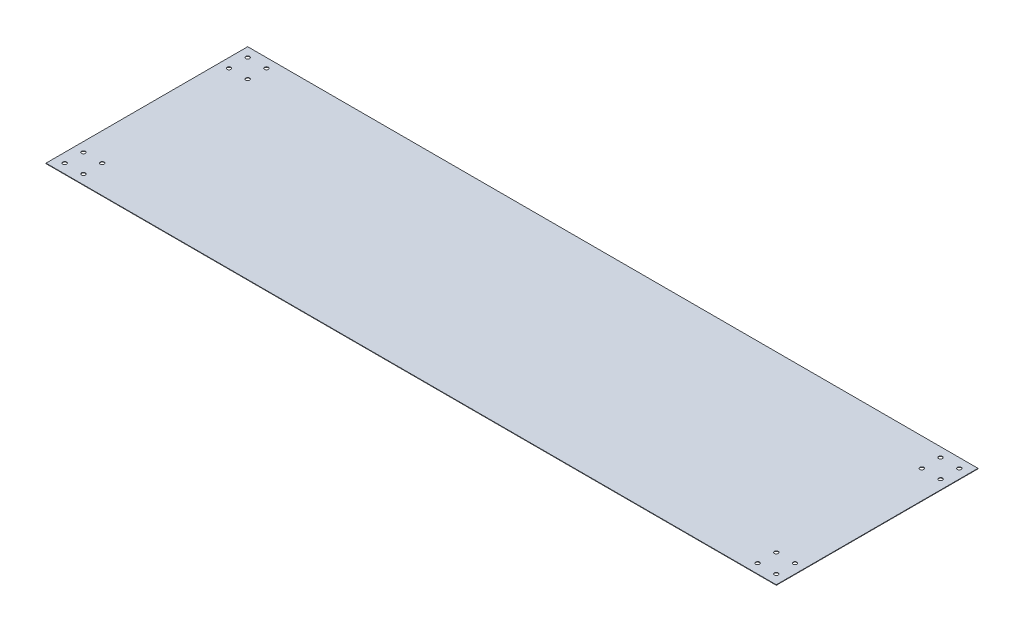
ISO-10303-21;
HEADER;
FILE_DESCRIPTION(('STEP AP214'),'2;1');
FILE_NAME('part.step','',(''),(''),'','','');
FILE_SCHEMA(('AUTOMOTIVE_DESIGN { 1 0 10303 214 1 1 1 1 }'));
ENDSEC;
DATA;
#1=APPLICATION_CONTEXT('core data for automotive mechanical design processes');
#2=APPLICATION_PROTOCOL_DEFINITION('international standard','automotive_design',2000,#1);
#3=PRODUCT_CONTEXT('',#1,'mechanical');
#4=PRODUCT('Part','Part','',(#3));
#5=PRODUCT_RELATED_PRODUCT_CATEGORY('part','',(#4));
#6=PRODUCT_DEFINITION_FORMATION('','',#4);
#7=PRODUCT_DEFINITION_CONTEXT('part definition',#1,'design');
#8=PRODUCT_DEFINITION('design','',#6,#7);
#9=PRODUCT_DEFINITION_SHAPE('','',#8);
#10=(LENGTH_UNIT() NAMED_UNIT(*) SI_UNIT(.MILLI.,.METRE.));
#11=(NAMED_UNIT(*) PLANE_ANGLE_UNIT() SI_UNIT($,.RADIAN.));
#12=(NAMED_UNIT(*) SI_UNIT($,.STERADIAN.) SOLID_ANGLE_UNIT());
#13=UNCERTAINTY_MEASURE_WITH_UNIT(LENGTH_MEASURE(1.E-05),#10,'distance_accuracy_value','');
#14=(GEOMETRIC_REPRESENTATION_CONTEXT(3) GLOBAL_UNCERTAINTY_ASSIGNED_CONTEXT((#13)) GLOBAL_UNIT_ASSIGNED_CONTEXT((#10,
#11,#12)) REPRESENTATION_CONTEXT('',''));
#15=CARTESIAN_POINT('',(0.,0.,0.));
#16=DIRECTION('',(0.,0.,1.));
#17=DIRECTION('',(1.,0.,0.));
#18=AXIS2_PLACEMENT_3D('',#15,#16,#17);
#19=CARTESIAN_POINT('',(0.,1.,0.));
#20=DIRECTION('',(0.,1.,0.));
#21=DIRECTION('',(0.,0.,1.));
#22=AXIS2_PLACEMENT_3D('',#19,#20,#21);
#23=PLANE('',#22);
#24=CARTESIAN_POINT('',(720.005,1.,-155.425));
#25=DIRECTION('',(0.,1.,0.));
#26=DIRECTION('',(0.,0.,1.));
#27=AXIS2_PLACEMENT_3D('',#24,#25,#26);
#28=CIRCLE('',#27,4.10000000000004);
#29=CARTESIAN_POINT('',(720.005,1.,-151.325));
#30=VERTEX_POINT('',#29);
#31=EDGE_CURVE('E193',#30,#30,#28,.T.);
#32=ORIENTED_EDGE('',*,*,#31,.F.);
#33=EDGE_LOOP('',(#32));
#34=FACE_BOUND('',#33,.T.);
#35=CARTESIAN_POINT('',(760.005,1.,-155.425));
#36=DIRECTION('',(0.,1.,0.));
#37=DIRECTION('',(0.,0.,1.));
#38=AXIS2_PLACEMENT_3D('',#35,#36,#37);
#39=CIRCLE('',#38,4.10000000000004);
#40=CARTESIAN_POINT('',(760.005,1.,-151.325));
#41=VERTEX_POINT('',#40);
#42=EDGE_CURVE('E181',#41,#41,#39,.T.);
#43=ORIENTED_EDGE('',*,*,#42,.F.);
#44=EDGE_LOOP('',(#43));
#45=FACE_BOUND('',#44,.T.);
#46=CARTESIAN_POINT('',(760.005,1.,155.425));
#47=DIRECTION('',(0.,1.,0.));
#48=DIRECTION('',(0.,0.,1.));
#49=AXIS2_PLACEMENT_3D('',#46,#47,#48);
#50=CIRCLE('',#49,4.10000000000004);
#51=CARTESIAN_POINT('',(760.005,1.,159.525));
#52=VERTEX_POINT('',#51);
#53=EDGE_CURVE('E169',#52,#52,#50,.T.);
#54=ORIENTED_EDGE('',*,*,#53,.F.);
#55=EDGE_LOOP('',(#54));
#56=FACE_BOUND('',#55,.T.);
#57=CARTESIAN_POINT('',(720.005,1.,195.425));
#58=DIRECTION('',(0.,1.,0.));
#59=DIRECTION('',(0.,0.,1.));
#60=AXIS2_PLACEMENT_3D('',#57,#58,#59);
#61=CIRCLE('',#60,4.10000000000004);
#62=CARTESIAN_POINT('',(720.005,1.,199.525));
#63=VERTEX_POINT('',#62);
#64=EDGE_CURVE('E157',#63,#63,#61,.T.);
#65=ORIENTED_EDGE('',*,*,#64,.F.);
#66=EDGE_LOOP('',(#65));
#67=FACE_BOUND('',#66,.T.);
#68=CARTESIAN_POINT('',(-720.005,1.,155.425));
#69=DIRECTION('',(0.,1.,0.));
#70=DIRECTION('',(0.,0.,1.));
#71=AXIS2_PLACEMENT_3D('',#68,#69,#70);
#72=CIRCLE('',#71,4.10000000000004);
#73=CARTESIAN_POINT('',(-720.005,1.,159.525));
#74=VERTEX_POINT('',#73);
#75=EDGE_CURVE('E145',#74,#74,#72,.T.);
#76=ORIENTED_EDGE('',*,*,#75,.F.);
#77=EDGE_LOOP('',(#76));
#78=FACE_BOUND('',#77,.T.);
#79=CARTESIAN_POINT('',(-760.005,1.,195.425));
#80=DIRECTION('',(0.,1.,0.));
#81=DIRECTION('',(0.,0.,1.));
#82=AXIS2_PLACEMENT_3D('',#79,#80,#81);
#83=CIRCLE('',#82,4.10000000000004);
#84=CARTESIAN_POINT('',(-760.005,1.,199.525));
#85=VERTEX_POINT('',#84);
#86=EDGE_CURVE('E133',#85,#85,#83,.T.);
#87=ORIENTED_EDGE('',*,*,#86,.F.);
#88=EDGE_LOOP('',(#87));
#89=FACE_BOUND('',#88,.T.);
#90=CARTESIAN_POINT('',(-720.005,1.,-155.425));
#91=DIRECTION('',(0.,1.,0.));
#92=DIRECTION('',(0.,0.,1.));
#93=AXIS2_PLACEMENT_3D('',#90,#91,#92);
#94=CIRCLE('',#93,4.10000000000004);
#95=CARTESIAN_POINT('',(-720.005,1.,-151.325));
#96=VERTEX_POINT('',#95);
#97=EDGE_CURVE('E121',#96,#96,#94,.T.);
#98=ORIENTED_EDGE('',*,*,#97,.F.);
#99=EDGE_LOOP('',(#98));
#100=FACE_BOUND('',#99,.T.);
#101=CARTESIAN_POINT('',(-760.005,1.,-195.425));
#102=DIRECTION('',(0.,1.,0.));
#103=DIRECTION('',(0.,0.,1.));
#104=AXIS2_PLACEMENT_3D('',#101,#102,#103);
#105=CIRCLE('',#104,4.10000000000004);
#106=CARTESIAN_POINT('',(-760.005,1.,-191.325));
#107=VERTEX_POINT('',#106);
#108=EDGE_CURVE('E100',#107,#107,#105,.T.);
#109=ORIENTED_EDGE('',*,*,#108,.F.);
#110=EDGE_LOOP('',(#109));
#111=FACE_BOUND('',#110,.T.);
#112=DIRECTION('',(0.,0.,-1.));
#113=VECTOR('',#112,1.);
#114=CARTESIAN_POINT('',(780.005,1.,-215.425));
#115=LINE('',#114,#113);
#116=CARTESIAN_POINT('',(780.005,1.,215.425));
#117=VERTEX_POINT('',#116);
#118=CARTESIAN_POINT('',(780.005,1.,-215.425));
#119=VERTEX_POINT('',#118);
#120=EDGE_CURVE('E85',#117,#119,#115,.T.);
#121=ORIENTED_EDGE('',*,*,#120,.T.);
#122=DIRECTION('',(-1.,0.,0.));
#123=VECTOR('',#122,1.);
#124=CARTESIAN_POINT('',(-780.005,1.,-215.425));
#125=LINE('',#124,#123);
#126=CARTESIAN_POINT('',(-780.005,1.,-215.425));
#127=VERTEX_POINT('',#126);
#128=EDGE_CURVE('E80',#119,#127,#125,.T.);
#129=ORIENTED_EDGE('',*,*,#128,.T.);
#130=DIRECTION('',(0.,0.,1.));
#131=VECTOR('',#130,1.);
#132=CARTESIAN_POINT('',(-780.005,1.,-215.425));
#133=LINE('',#132,#131);
#134=CARTESIAN_POINT('',(-780.005,1.,215.425));
#135=VERTEX_POINT('',#134);
#136=EDGE_CURVE('E83',#127,#135,#133,.T.);
#137=ORIENTED_EDGE('',*,*,#136,.T.);
#138=DIRECTION('',(1.,0.,0.));
#139=VECTOR('',#138,1.);
#140=CARTESIAN_POINT('',(-780.005,1.,215.425));
#141=LINE('',#140,#139);
#142=EDGE_CURVE('E50',#135,#117,#141,.T.);
#143=ORIENTED_EDGE('',*,*,#142,.T.);
#144=EDGE_LOOP('',(#121,#129,#137,#143));
#145=FACE_BOUND('',#144,.T.);
#146=CARTESIAN_POINT('',(-720.005,1.,-195.425));
#147=DIRECTION('',(0.,1.,0.));
#148=DIRECTION('',(0.,0.,1.));
#149=AXIS2_PLACEMENT_3D('',#146,#147,#148);
#150=CIRCLE('',#149,4.10000000000004);
#151=CARTESIAN_POINT('',(-720.005,1.,-191.325));
#152=VERTEX_POINT('',#151);
#153=EDGE_CURVE('E115',#152,#152,#150,.T.);
#154=ORIENTED_EDGE('',*,*,#153,.F.);
#155=EDGE_LOOP('',(#154));
#156=FACE_BOUND('',#155,.T.);
#157=CARTESIAN_POINT('',(-760.005,1.,-155.425));
#158=DIRECTION('',(0.,1.,0.));
#159=DIRECTION('',(0.,0.,1.));
#160=AXIS2_PLACEMENT_3D('',#157,#158,#159);
#161=CIRCLE('',#160,4.10000000000004);
#162=CARTESIAN_POINT('',(-760.005,1.,-151.325));
#163=VERTEX_POINT('',#162);
#164=EDGE_CURVE('E127',#163,#163,#161,.T.);
#165=ORIENTED_EDGE('',*,*,#164,.F.);
#166=EDGE_LOOP('',(#165));
#167=FACE_BOUND('',#166,.T.);
#168=CARTESIAN_POINT('',(-760.005,1.,155.425));
#169=DIRECTION('',(0.,1.,0.));
#170=DIRECTION('',(0.,0.,1.));
#171=AXIS2_PLACEMENT_3D('',#168,#169,#170);
#172=CIRCLE('',#171,4.10000000000004);
#173=CARTESIAN_POINT('',(-760.005,1.,159.525));
#174=VERTEX_POINT('',#173);
#175=EDGE_CURVE('E139',#174,#174,#172,.T.);
#176=ORIENTED_EDGE('',*,*,#175,.F.);
#177=EDGE_LOOP('',(#176));
#178=FACE_BOUND('',#177,.T.);
#179=CARTESIAN_POINT('',(-720.005,1.,195.425));
#180=DIRECTION('',(0.,1.,0.));
#181=DIRECTION('',(0.,0.,1.));
#182=AXIS2_PLACEMENT_3D('',#179,#180,#181);
#183=CIRCLE('',#182,4.10000000000004);
#184=CARTESIAN_POINT('',(-720.005,1.,199.525));
#185=VERTEX_POINT('',#184);
#186=EDGE_CURVE('E151',#185,#185,#183,.T.);
#187=ORIENTED_EDGE('',*,*,#186,.F.);
#188=EDGE_LOOP('',(#187));
#189=FACE_BOUND('',#188,.T.);
#190=CARTESIAN_POINT('',(760.005,1.,195.425));
#191=DIRECTION('',(0.,1.,0.));
#192=DIRECTION('',(0.,0.,1.));
#193=AXIS2_PLACEMENT_3D('',#190,#191,#192);
#194=CIRCLE('',#193,4.10000000000004);
#195=CARTESIAN_POINT('',(760.005,1.,199.525));
#196=VERTEX_POINT('',#195);
#197=EDGE_CURVE('E163',#196,#196,#194,.T.);
#198=ORIENTED_EDGE('',*,*,#197,.F.);
#199=EDGE_LOOP('',(#198));
#200=FACE_BOUND('',#199,.T.);
#201=CARTESIAN_POINT('',(720.005,1.,155.425));
#202=DIRECTION('',(0.,1.,0.));
#203=DIRECTION('',(0.,0.,1.));
#204=AXIS2_PLACEMENT_3D('',#201,#202,#203);
#205=CIRCLE('',#204,4.10000000000004);
#206=CARTESIAN_POINT('',(720.005,1.,159.525));
#207=VERTEX_POINT('',#206);
#208=EDGE_CURVE('E175',#207,#207,#205,.T.);
#209=ORIENTED_EDGE('',*,*,#208,.F.);
#210=EDGE_LOOP('',(#209));
#211=FACE_BOUND('',#210,.T.);
#212=CARTESIAN_POINT('',(760.005,1.,-195.425));
#213=DIRECTION('',(0.,1.,0.));
#214=DIRECTION('',(0.,0.,1.));
#215=AXIS2_PLACEMENT_3D('',#212,#213,#214);
#216=CIRCLE('',#215,4.10000000000004);
#217=CARTESIAN_POINT('',(760.005,1.,-191.325));
#218=VERTEX_POINT('',#217);
#219=EDGE_CURVE('E187',#218,#218,#216,.T.);
#220=ORIENTED_EDGE('',*,*,#219,.F.);
#221=EDGE_LOOP('',(#220));
#222=FACE_BOUND('',#221,.T.);
#223=CARTESIAN_POINT('',(720.005,1.,-195.425));
#224=DIRECTION('',(0.,1.,0.));
#225=DIRECTION('',(0.,0.,1.));
#226=AXIS2_PLACEMENT_3D('',#223,#224,#225);
#227=CIRCLE('',#226,4.10000000000004);
#228=CARTESIAN_POINT('',(720.005,1.,-191.325));
#229=VERTEX_POINT('',#228);
#230=EDGE_CURVE('E199',#229,#229,#227,.T.);
#231=ORIENTED_EDGE('',*,*,#230,.F.);
#232=EDGE_LOOP('',(#231));
#233=FACE_BOUND('',#232,.T.);
#234=ADVANCED_FACE('F33',(#34,#45,#56,#67,#78,#89,#100,#111,#145,#156,#167,#178,#189,#200,#211,
#222,#233),#23,.T.);
#235=CARTESIAN_POINT('',(0.,0.,0.));
#236=DIRECTION('',(0.,1.,0.));
#237=DIRECTION('',(0.,0.,1.));
#238=AXIS2_PLACEMENT_3D('',#235,#236,#237);
#239=PLANE('',#238);
#240=DIRECTION('',(0.,0.,-1.));
#241=VECTOR('',#240,1.);
#242=CARTESIAN_POINT('',(780.005,0.,-215.425));
#243=LINE('',#242,#241);
#244=CARTESIAN_POINT('',(780.005,0.,215.425));
#245=VERTEX_POINT('',#244);
#246=CARTESIAN_POINT('',(780.005,0.,-215.425));
#247=VERTEX_POINT('',#246);
#248=EDGE_CURVE('E97',#245,#247,#243,.T.);
#249=ORIENTED_EDGE('',*,*,#248,.F.);
#250=DIRECTION('',(1.,0.,0.));
#251=VECTOR('',#250,1.);
#252=CARTESIAN_POINT('',(-780.005,0.,215.425));
#253=LINE('',#252,#251);
#254=CARTESIAN_POINT('',(-780.005,0.,215.425));
#255=VERTEX_POINT('',#254);
#256=EDGE_CURVE('E73',#255,#245,#253,.T.);
#257=ORIENTED_EDGE('',*,*,#256,.F.);
#258=DIRECTION('',(0.,0.,1.));
#259=VECTOR('',#258,1.);
#260=CARTESIAN_POINT('',(-780.005,0.,-215.425));
#261=LINE('',#260,#259);
#262=CARTESIAN_POINT('',(-780.005,0.,-215.425));
#263=VERTEX_POINT('',#262);
#264=EDGE_CURVE('E67',#263,#255,#261,.T.);
#265=ORIENTED_EDGE('',*,*,#264,.F.);
#266=DIRECTION('',(-1.,0.,0.));
#267=VECTOR('',#266,1.);
#268=CARTESIAN_POINT('',(-780.005,0.,-215.425));
#269=LINE('',#268,#267);
#270=EDGE_CURVE('E89',#247,#263,#269,.T.);
#271=ORIENTED_EDGE('',*,*,#270,.F.);
#272=EDGE_LOOP('',(#249,#257,#265,#271));
#273=FACE_BOUND('',#272,.T.);
#274=CARTESIAN_POINT('',(-760.005,0.,-195.425));
#275=DIRECTION('',(0.,1.,0.));
#276=DIRECTION('',(0.,0.,1.));
#277=AXIS2_PLACEMENT_3D('',#274,#275,#276);
#278=CIRCLE('',#277,4.10000000000004);
#279=CARTESIAN_POINT('',(-760.005,0.,-191.325));
#280=VERTEX_POINT('',#279);
#281=EDGE_CURVE('E112',#280,#280,#278,.T.);
#282=ORIENTED_EDGE('',*,*,#281,.T.);
#283=EDGE_LOOP('',(#282));
#284=FACE_BOUND('',#283,.T.);
#285=CARTESIAN_POINT('',(-720.005,0.,-195.425));
#286=DIRECTION('',(0.,1.,0.));
#287=DIRECTION('',(0.,0.,1.));
#288=AXIS2_PLACEMENT_3D('',#285,#286,#287);
#289=CIRCLE('',#288,4.10000000000004);
#290=CARTESIAN_POINT('',(-720.005,0.,-191.325));
#291=VERTEX_POINT('',#290);
#292=EDGE_CURVE('E118',#291,#291,#289,.T.);
#293=ORIENTED_EDGE('',*,*,#292,.T.);
#294=EDGE_LOOP('',(#293));
#295=FACE_BOUND('',#294,.T.);
#296=CARTESIAN_POINT('',(-720.005,0.,-155.425));
#297=DIRECTION('',(0.,1.,0.));
#298=DIRECTION('',(0.,0.,1.));
#299=AXIS2_PLACEMENT_3D('',#296,#297,#298);
#300=CIRCLE('',#299,4.10000000000004);
#301=CARTESIAN_POINT('',(-720.005,0.,-151.325));
#302=VERTEX_POINT('',#301);
#303=EDGE_CURVE('E124',#302,#302,#300,.T.);
#304=ORIENTED_EDGE('',*,*,#303,.T.);
#305=EDGE_LOOP('',(#304));
#306=FACE_BOUND('',#305,.T.);
#307=CARTESIAN_POINT('',(-760.005,0.,-155.425));
#308=DIRECTION('',(0.,1.,0.));
#309=DIRECTION('',(0.,0.,1.));
#310=AXIS2_PLACEMENT_3D('',#307,#308,#309);
#311=CIRCLE('',#310,4.10000000000004);
#312=CARTESIAN_POINT('',(-760.005,0.,-151.325));
#313=VERTEX_POINT('',#312);
#314=EDGE_CURVE('E130',#313,#313,#311,.T.);
#315=ORIENTED_EDGE('',*,*,#314,.T.);
#316=EDGE_LOOP('',(#315));
#317=FACE_BOUND('',#316,.T.);
#318=CARTESIAN_POINT('',(-760.005,0.,195.425));
#319=DIRECTION('',(0.,1.,0.));
#320=DIRECTION('',(0.,0.,1.));
#321=AXIS2_PLACEMENT_3D('',#318,#319,#320);
#322=CIRCLE('',#321,4.10000000000004);
#323=CARTESIAN_POINT('',(-760.005,0.,199.525));
#324=VERTEX_POINT('',#323);
#325=EDGE_CURVE('E136',#324,#324,#322,.T.);
#326=ORIENTED_EDGE('',*,*,#325,.T.);
#327=EDGE_LOOP('',(#326));
#328=FACE_BOUND('',#327,.T.);
#329=CARTESIAN_POINT('',(-760.005,0.,155.425));
#330=DIRECTION('',(0.,1.,0.));
#331=DIRECTION('',(0.,0.,1.));
#332=AXIS2_PLACEMENT_3D('',#329,#330,#331);
#333=CIRCLE('',#332,4.10000000000004);
#334=CARTESIAN_POINT('',(-760.005,0.,159.525));
#335=VERTEX_POINT('',#334);
#336=EDGE_CURVE('E142',#335,#335,#333,.T.);
#337=ORIENTED_EDGE('',*,*,#336,.T.);
#338=EDGE_LOOP('',(#337));
#339=FACE_BOUND('',#338,.T.);
#340=CARTESIAN_POINT('',(-720.005,0.,155.425));
#341=DIRECTION('',(0.,1.,0.));
#342=DIRECTION('',(0.,0.,1.));
#343=AXIS2_PLACEMENT_3D('',#340,#341,#342);
#344=CIRCLE('',#343,4.10000000000004);
#345=CARTESIAN_POINT('',(-720.005,0.,159.525));
#346=VERTEX_POINT('',#345);
#347=EDGE_CURVE('E148',#346,#346,#344,.T.);
#348=ORIENTED_EDGE('',*,*,#347,.T.);
#349=EDGE_LOOP('',(#348));
#350=FACE_BOUND('',#349,.T.);
#351=CARTESIAN_POINT('',(-720.005,0.,195.425));
#352=DIRECTION('',(0.,1.,0.));
#353=DIRECTION('',(0.,0.,1.));
#354=AXIS2_PLACEMENT_3D('',#351,#352,#353);
#355=CIRCLE('',#354,4.10000000000004);
#356=CARTESIAN_POINT('',(-720.005,0.,199.525));
#357=VERTEX_POINT('',#356);
#358=EDGE_CURVE('E154',#357,#357,#355,.T.);
#359=ORIENTED_EDGE('',*,*,#358,.T.);
#360=EDGE_LOOP('',(#359));
#361=FACE_BOUND('',#360,.T.);
#362=CARTESIAN_POINT('',(720.005,0.,195.425));
#363=DIRECTION('',(0.,1.,0.));
#364=DIRECTION('',(0.,0.,1.));
#365=AXIS2_PLACEMENT_3D('',#362,#363,#364);
#366=CIRCLE('',#365,4.10000000000004);
#367=CARTESIAN_POINT('',(720.005,0.,199.525));
#368=VERTEX_POINT('',#367);
#369=EDGE_CURVE('E160',#368,#368,#366,.T.);
#370=ORIENTED_EDGE('',*,*,#369,.T.);
#371=EDGE_LOOP('',(#370));
#372=FACE_BOUND('',#371,.T.);
#373=CARTESIAN_POINT('',(760.005,0.,195.425));
#374=DIRECTION('',(0.,1.,0.));
#375=DIRECTION('',(0.,0.,1.));
#376=AXIS2_PLACEMENT_3D('',#373,#374,#375);
#377=CIRCLE('',#376,4.10000000000004);
#378=CARTESIAN_POINT('',(760.005,0.,199.525));
#379=VERTEX_POINT('',#378);
#380=EDGE_CURVE('E166',#379,#379,#377,.T.);
#381=ORIENTED_EDGE('',*,*,#380,.T.);
#382=EDGE_LOOP('',(#381));
#383=FACE_BOUND('',#382,.T.);
#384=CARTESIAN_POINT('',(760.005,0.,155.425));
#385=DIRECTION('',(0.,1.,0.));
#386=DIRECTION('',(0.,0.,1.));
#387=AXIS2_PLACEMENT_3D('',#384,#385,#386);
#388=CIRCLE('',#387,4.10000000000004);
#389=CARTESIAN_POINT('',(760.005,0.,159.525));
#390=VERTEX_POINT('',#389);
#391=EDGE_CURVE('E172',#390,#390,#388,.T.);
#392=ORIENTED_EDGE('',*,*,#391,.T.);
#393=EDGE_LOOP('',(#392));
#394=FACE_BOUND('',#393,.T.);
#395=CARTESIAN_POINT('',(720.005,0.,155.425));
#396=DIRECTION('',(0.,1.,0.));
#397=DIRECTION('',(0.,0.,1.));
#398=AXIS2_PLACEMENT_3D('',#395,#396,#397);
#399=CIRCLE('',#398,4.10000000000004);
#400=CARTESIAN_POINT('',(720.005,0.,159.525));
#401=VERTEX_POINT('',#400);
#402=EDGE_CURVE('E178',#401,#401,#399,.T.);
#403=ORIENTED_EDGE('',*,*,#402,.T.);
#404=EDGE_LOOP('',(#403));
#405=FACE_BOUND('',#404,.T.);
#406=CARTESIAN_POINT('',(760.005,0.,-155.425));
#407=DIRECTION('',(0.,1.,0.));
#408=DIRECTION('',(0.,0.,1.));
#409=AXIS2_PLACEMENT_3D('',#406,#407,#408);
#410=CIRCLE('',#409,4.10000000000004);
#411=CARTESIAN_POINT('',(760.005,0.,-151.325));
#412=VERTEX_POINT('',#411);
#413=EDGE_CURVE('E184',#412,#412,#410,.T.);
#414=ORIENTED_EDGE('',*,*,#413,.T.);
#415=EDGE_LOOP('',(#414));
#416=FACE_BOUND('',#415,.T.);
#417=CARTESIAN_POINT('',(760.005,0.,-195.425));
#418=DIRECTION('',(0.,1.,0.));
#419=DIRECTION('',(0.,0.,1.));
#420=AXIS2_PLACEMENT_3D('',#417,#418,#419);
#421=CIRCLE('',#420,4.10000000000004);
#422=CARTESIAN_POINT('',(760.005,0.,-191.325));
#423=VERTEX_POINT('',#422);
#424=EDGE_CURVE('E190',#423,#423,#421,.T.);
#425=ORIENTED_EDGE('',*,*,#424,.T.);
#426=EDGE_LOOP('',(#425));
#427=FACE_BOUND('',#426,.T.);
#428=CARTESIAN_POINT('',(720.005,0.,-155.425));
#429=DIRECTION('',(0.,1.,0.));
#430=DIRECTION('',(0.,0.,1.));
#431=AXIS2_PLACEMENT_3D('',#428,#429,#430);
#432=CIRCLE('',#431,4.10000000000004);
#433=CARTESIAN_POINT('',(720.005,0.,-151.325));
#434=VERTEX_POINT('',#433);
#435=EDGE_CURVE('E196',#434,#434,#432,.T.);
#436=ORIENTED_EDGE('',*,*,#435,.T.);
#437=EDGE_LOOP('',(#436));
#438=FACE_BOUND('',#437,.T.);
#439=CARTESIAN_POINT('',(720.005,0.,-195.425));
#440=DIRECTION('',(0.,1.,0.));
#441=DIRECTION('',(0.,0.,1.));
#442=AXIS2_PLACEMENT_3D('',#439,#440,#441);
#443=CIRCLE('',#442,4.10000000000004);
#444=CARTESIAN_POINT('',(720.005,0.,-191.325));
#445=VERTEX_POINT('',#444);
#446=EDGE_CURVE('E202',#445,#445,#443,.T.);
#447=ORIENTED_EDGE('',*,*,#446,.T.);
#448=EDGE_LOOP('',(#447));
#449=FACE_BOUND('',#448,.T.);
#450=ADVANCED_FACE('F108',(#273,#284,#295,#306,#317,#328,#339,#350,#361,#372,#383,#394,#405,
#416,#427,#438,#449),#239,.F.);
#451=CARTESIAN_POINT('',(780.005,1.,-215.425));
#452=DIRECTION('',(-1.,0.,0.));
#453=DIRECTION('',(0.,0.,1.));
#454=AXIS2_PLACEMENT_3D('',#451,#452,#453);
#455=PLANE('',#454);
#456=ORIENTED_EDGE('',*,*,#248,.T.);
#457=DIRECTION('',(0.,-1.,0.));
#458=VECTOR('',#457,1.);
#459=CARTESIAN_POINT('',(780.005,1.,-215.425));
#460=LINE('',#459,#458);
#461=EDGE_CURVE('E11',#119,#247,#460,.T.);
#462=ORIENTED_EDGE('',*,*,#461,.F.);
#463=ORIENTED_EDGE('',*,*,#120,.F.);
#464=DIRECTION('',(0.,-1.,0.));
#465=VECTOR('',#464,1.);
#466=CARTESIAN_POINT('',(780.005,1.,215.425));
#467=LINE('',#466,#465);
#468=EDGE_CURVE('E93',#117,#245,#467,.T.);
#469=ORIENTED_EDGE('',*,*,#468,.T.);
#470=EDGE_LOOP('',(#456,#462,#463,#469));
#471=FACE_BOUND('',#470,.T.);
#472=ADVANCED_FACE('F35',(#471),#455,.F.);
#473=CARTESIAN_POINT('',(-780.005,1.,-215.425));
#474=DIRECTION('',(0.,0.,1.));
#475=DIRECTION('',(1.,0.,0.));
#476=AXIS2_PLACEMENT_3D('',#473,#474,#475);
#477=PLANE('',#476);
#478=ORIENTED_EDGE('',*,*,#270,.T.);
#479=DIRECTION('',(0.,-1.,0.));
#480=VECTOR('',#479,1.);
#481=CARTESIAN_POINT('',(-780.005,1.,-215.425));
#482=LINE('',#481,#480);
#483=EDGE_CURVE('E42',#127,#263,#482,.T.);
#484=ORIENTED_EDGE('',*,*,#483,.F.);
#485=ORIENTED_EDGE('',*,*,#128,.F.);
#486=ORIENTED_EDGE('',*,*,#461,.T.);
#487=EDGE_LOOP('',(#478,#484,#485,#486));
#488=FACE_BOUND('',#487,.T.);
#489=ADVANCED_FACE('F88',(#488),#477,.F.);
#490=CARTESIAN_POINT('',(-780.005,1.,-215.425));
#491=DIRECTION('',(1.,0.,0.));
#492=DIRECTION('',(0.,0.,-1.));
#493=AXIS2_PLACEMENT_3D('',#490,#491,#492);
#494=PLANE('',#493);
#495=ORIENTED_EDGE('',*,*,#264,.T.);
#496=DIRECTION('',(0.,-1.,0.));
#497=VECTOR('',#496,1.);
#498=CARTESIAN_POINT('',(-780.005,1.,215.425));
#499=LINE('',#498,#497);
#500=EDGE_CURVE('E90',#135,#255,#499,.T.);
#501=ORIENTED_EDGE('',*,*,#500,.F.);
#502=ORIENTED_EDGE('',*,*,#136,.F.);
#503=ORIENTED_EDGE('',*,*,#483,.T.);
#504=EDGE_LOOP('',(#495,#501,#502,#503));
#505=FACE_BOUND('',#504,.T.);
#506=ADVANCED_FACE('F91',(#505),#494,.F.);
#507=CARTESIAN_POINT('',(-780.005,1.,215.425));
#508=DIRECTION('',(0.,0.,-1.));
#509=DIRECTION('',(-1.,0.,0.));
#510=AXIS2_PLACEMENT_3D('',#507,#508,#509);
#511=PLANE('',#510);
#512=ORIENTED_EDGE('',*,*,#256,.T.);
#513=ORIENTED_EDGE('',*,*,#468,.F.);
#514=ORIENTED_EDGE('',*,*,#142,.F.);
#515=ORIENTED_EDGE('',*,*,#500,.T.);
#516=EDGE_LOOP('',(#512,#513,#514,#515));
#517=FACE_BOUND('',#516,.T.);
#518=ADVANCED_FACE('F105',(#517),#511,.F.);
#519=CARTESIAN_POINT('',(-760.005,1.,-195.425));
#520=DIRECTION('',(0.,-1.,0.));
#521=DIRECTION('',(0.,0.,-1.));
#522=AXIS2_PLACEMENT_3D('',#519,#520,#521);
#523=CYLINDRICAL_SURFACE('',#522,4.10000000000004);
#524=ORIENTED_EDGE('',*,*,#108,.T.);
#525=EDGE_LOOP('',(#524));
#526=FACE_BOUND('',#525,.T.);
#527=ORIENTED_EDGE('',*,*,#281,.F.);
#528=EDGE_LOOP('',(#527));
#529=FACE_BOUND('',#528,.T.);
#530=ADVANCED_FACE('F221',(#526,#529),#523,.F.);
#531=CARTESIAN_POINT('',(-720.005,1.,-195.425));
#532=DIRECTION('',(0.,-1.,0.));
#533=DIRECTION('',(0.,0.,-1.));
#534=AXIS2_PLACEMENT_3D('',#531,#532,#533);
#535=CYLINDRICAL_SURFACE('',#534,4.10000000000004);
#536=ORIENTED_EDGE('',*,*,#153,.T.);
#537=EDGE_LOOP('',(#536));
#538=FACE_BOUND('',#537,.T.);
#539=ORIENTED_EDGE('',*,*,#292,.F.);
#540=EDGE_LOOP('',(#539));
#541=FACE_BOUND('',#540,.T.);
#542=ADVANCED_FACE('F267',(#538,#541),#535,.F.);
#543=CARTESIAN_POINT('',(-720.005,1.,-155.425));
#544=DIRECTION('',(0.,-1.,0.));
#545=DIRECTION('',(0.,0.,-1.));
#546=AXIS2_PLACEMENT_3D('',#543,#544,#545);
#547=CYLINDRICAL_SURFACE('',#546,4.10000000000004);
#548=ORIENTED_EDGE('',*,*,#97,.T.);
#549=EDGE_LOOP('',(#548));
#550=FACE_BOUND('',#549,.T.);
#551=ORIENTED_EDGE('',*,*,#303,.F.);
#552=EDGE_LOOP('',(#551));
#553=FACE_BOUND('',#552,.T.);
#554=ADVANCED_FACE('F275',(#550,#553),#547,.F.);
#555=CARTESIAN_POINT('',(-760.005,1.,-155.425));
#556=DIRECTION('',(0.,-1.,0.));
#557=DIRECTION('',(0.,0.,-1.));
#558=AXIS2_PLACEMENT_3D('',#555,#556,#557);
#559=CYLINDRICAL_SURFACE('',#558,4.10000000000004);
#560=ORIENTED_EDGE('',*,*,#164,.T.);
#561=EDGE_LOOP('',(#560));
#562=FACE_BOUND('',#561,.T.);
#563=ORIENTED_EDGE('',*,*,#314,.F.);
#564=EDGE_LOOP('',(#563));
#565=FACE_BOUND('',#564,.T.);
#566=ADVANCED_FACE('F283',(#562,#565),#559,.F.);
#567=CARTESIAN_POINT('',(-760.005,1.,195.425));
#568=DIRECTION('',(0.,-1.,0.));
#569=DIRECTION('',(0.,0.,-1.));
#570=AXIS2_PLACEMENT_3D('',#567,#568,#569);
#571=CYLINDRICAL_SURFACE('',#570,4.10000000000004);
#572=ORIENTED_EDGE('',*,*,#86,.T.);
#573=EDGE_LOOP('',(#572));
#574=FACE_BOUND('',#573,.T.);
#575=ORIENTED_EDGE('',*,*,#325,.F.);
#576=EDGE_LOOP('',(#575));
#577=FACE_BOUND('',#576,.T.);
#578=ADVANCED_FACE('F292',(#574,#577),#571,.F.);
#579=CARTESIAN_POINT('',(-760.005,1.,155.425));
#580=DIRECTION('',(0.,-1.,0.));
#581=DIRECTION('',(0.,0.,-1.));
#582=AXIS2_PLACEMENT_3D('',#579,#580,#581);
#583=CYLINDRICAL_SURFACE('',#582,4.10000000000004);
#584=ORIENTED_EDGE('',*,*,#175,.T.);
#585=EDGE_LOOP('',(#584));
#586=FACE_BOUND('',#585,.T.);
#587=ORIENTED_EDGE('',*,*,#336,.F.);
#588=EDGE_LOOP('',(#587));
#589=FACE_BOUND('',#588,.T.);
#590=ADVANCED_FACE('F301',(#586,#589),#583,.F.);
#591=CARTESIAN_POINT('',(-720.005,1.,155.425));
#592=DIRECTION('',(0.,-1.,0.));
#593=DIRECTION('',(0.,0.,-1.));
#594=AXIS2_PLACEMENT_3D('',#591,#592,#593);
#595=CYLINDRICAL_SURFACE('',#594,4.10000000000004);
#596=ORIENTED_EDGE('',*,*,#75,.T.);
#597=EDGE_LOOP('',(#596));
#598=FACE_BOUND('',#597,.T.);
#599=ORIENTED_EDGE('',*,*,#347,.F.);
#600=EDGE_LOOP('',(#599));
#601=FACE_BOUND('',#600,.T.);
#602=ADVANCED_FACE('F310',(#598,#601),#595,.F.);
#603=CARTESIAN_POINT('',(-720.005,1.,195.425));
#604=DIRECTION('',(0.,-1.,0.));
#605=DIRECTION('',(0.,0.,-1.));
#606=AXIS2_PLACEMENT_3D('',#603,#604,#605);
#607=CYLINDRICAL_SURFACE('',#606,4.10000000000004);
#608=ORIENTED_EDGE('',*,*,#186,.T.);
#609=EDGE_LOOP('',(#608));
#610=FACE_BOUND('',#609,.T.);
#611=ORIENTED_EDGE('',*,*,#358,.F.);
#612=EDGE_LOOP('',(#611));
#613=FACE_BOUND('',#612,.T.);
#614=ADVANCED_FACE('F319',(#610,#613),#607,.F.);
#615=CARTESIAN_POINT('',(720.005,1.,195.425));
#616=DIRECTION('',(0.,-1.,0.));
#617=DIRECTION('',(0.,0.,-1.));
#618=AXIS2_PLACEMENT_3D('',#615,#616,#617);
#619=CYLINDRICAL_SURFACE('',#618,4.10000000000004);
#620=ORIENTED_EDGE('',*,*,#64,.T.);
#621=EDGE_LOOP('',(#620));
#622=FACE_BOUND('',#621,.T.);
#623=ORIENTED_EDGE('',*,*,#369,.F.);
#624=EDGE_LOOP('',(#623));
#625=FACE_BOUND('',#624,.T.);
#626=ADVANCED_FACE('F328',(#622,#625),#619,.F.);
#627=CARTESIAN_POINT('',(760.005,1.,195.425));
#628=DIRECTION('',(0.,-1.,0.));
#629=DIRECTION('',(0.,0.,-1.));
#630=AXIS2_PLACEMENT_3D('',#627,#628,#629);
#631=CYLINDRICAL_SURFACE('',#630,4.10000000000004);
#632=ORIENTED_EDGE('',*,*,#197,.T.);
#633=EDGE_LOOP('',(#632));
#634=FACE_BOUND('',#633,.T.);
#635=ORIENTED_EDGE('',*,*,#380,.F.);
#636=EDGE_LOOP('',(#635));
#637=FACE_BOUND('',#636,.T.);
#638=ADVANCED_FACE('F337',(#634,#637),#631,.F.);
#639=CARTESIAN_POINT('',(760.005,1.,155.425));
#640=DIRECTION('',(0.,-1.,0.));
#641=DIRECTION('',(0.,0.,-1.));
#642=AXIS2_PLACEMENT_3D('',#639,#640,#641);
#643=CYLINDRICAL_SURFACE('',#642,4.10000000000004);
#644=ORIENTED_EDGE('',*,*,#53,.T.);
#645=EDGE_LOOP('',(#644));
#646=FACE_BOUND('',#645,.T.);
#647=ORIENTED_EDGE('',*,*,#391,.F.);
#648=EDGE_LOOP('',(#647));
#649=FACE_BOUND('',#648,.T.);
#650=ADVANCED_FACE('F346',(#646,#649),#643,.F.);
#651=CARTESIAN_POINT('',(720.005,1.,155.425));
#652=DIRECTION('',(0.,-1.,0.));
#653=DIRECTION('',(0.,0.,-1.));
#654=AXIS2_PLACEMENT_3D('',#651,#652,#653);
#655=CYLINDRICAL_SURFACE('',#654,4.10000000000004);
#656=ORIENTED_EDGE('',*,*,#208,.T.);
#657=EDGE_LOOP('',(#656));
#658=FACE_BOUND('',#657,.T.);
#659=ORIENTED_EDGE('',*,*,#402,.F.);
#660=EDGE_LOOP('',(#659));
#661=FACE_BOUND('',#660,.T.);
#662=ADVANCED_FACE('F355',(#658,#661),#655,.F.);
#663=CARTESIAN_POINT('',(760.005,1.,-155.425));
#664=DIRECTION('',(0.,-1.,0.));
#665=DIRECTION('',(0.,0.,-1.));
#666=AXIS2_PLACEMENT_3D('',#663,#664,#665);
#667=CYLINDRICAL_SURFACE('',#666,4.10000000000004);
#668=ORIENTED_EDGE('',*,*,#42,.T.);
#669=EDGE_LOOP('',(#668));
#670=FACE_BOUND('',#669,.T.);
#671=ORIENTED_EDGE('',*,*,#413,.F.);
#672=EDGE_LOOP('',(#671));
#673=FACE_BOUND('',#672,.T.);
#674=ADVANCED_FACE('F364',(#670,#673),#667,.F.);
#675=CARTESIAN_POINT('',(760.005,1.,-195.425));
#676=DIRECTION('',(0.,-1.,0.));
#677=DIRECTION('',(0.,0.,-1.));
#678=AXIS2_PLACEMENT_3D('',#675,#676,#677);
#679=CYLINDRICAL_SURFACE('',#678,4.10000000000004);
#680=ORIENTED_EDGE('',*,*,#219,.T.);
#681=EDGE_LOOP('',(#680));
#682=FACE_BOUND('',#681,.T.);
#683=ORIENTED_EDGE('',*,*,#424,.F.);
#684=EDGE_LOOP('',(#683));
#685=FACE_BOUND('',#684,.T.);
#686=ADVANCED_FACE('F373',(#682,#685),#679,.F.);
#687=CARTESIAN_POINT('',(720.005,1.,-155.425));
#688=DIRECTION('',(0.,-1.,0.));
#689=DIRECTION('',(0.,0.,-1.));
#690=AXIS2_PLACEMENT_3D('',#687,#688,#689);
#691=CYLINDRICAL_SURFACE('',#690,4.10000000000004);
#692=ORIENTED_EDGE('',*,*,#31,.T.);
#693=EDGE_LOOP('',(#692));
#694=FACE_BOUND('',#693,.T.);
#695=ORIENTED_EDGE('',*,*,#435,.F.);
#696=EDGE_LOOP('',(#695));
#697=FACE_BOUND('',#696,.T.);
#698=ADVANCED_FACE('F382',(#694,#697),#691,.F.);
#699=CARTESIAN_POINT('',(720.005,1.,-195.425));
#700=DIRECTION('',(0.,-1.,0.));
#701=DIRECTION('',(0.,0.,-1.));
#702=AXIS2_PLACEMENT_3D('',#699,#700,#701);
#703=CYLINDRICAL_SURFACE('',#702,4.10000000000004);
#704=ORIENTED_EDGE('',*,*,#230,.T.);
#705=EDGE_LOOP('',(#704));
#706=FACE_BOUND('',#705,.T.);
#707=ORIENTED_EDGE('',*,*,#446,.F.);
#708=EDGE_LOOP('',(#707));
#709=FACE_BOUND('',#708,.T.);
#710=ADVANCED_FACE('F208',(#706,#709),#703,.F.);
#711=CLOSED_SHELL('',(#234,#450,#472,#489,#506,#518,#530,#542,#554,#566,#578,#590,#602,#614,
#626,#638,#650,#662,#674,#686,#698,#710));
#712=MANIFOLD_SOLID_BREP('B2',#711);
#713=ADVANCED_BREP_SHAPE_REPRESENTATION('',(#18,#712),#14);
#714=SHAPE_DEFINITION_REPRESENTATION(#9,#713);
ENDSEC;
END-ISO-10303-21;
